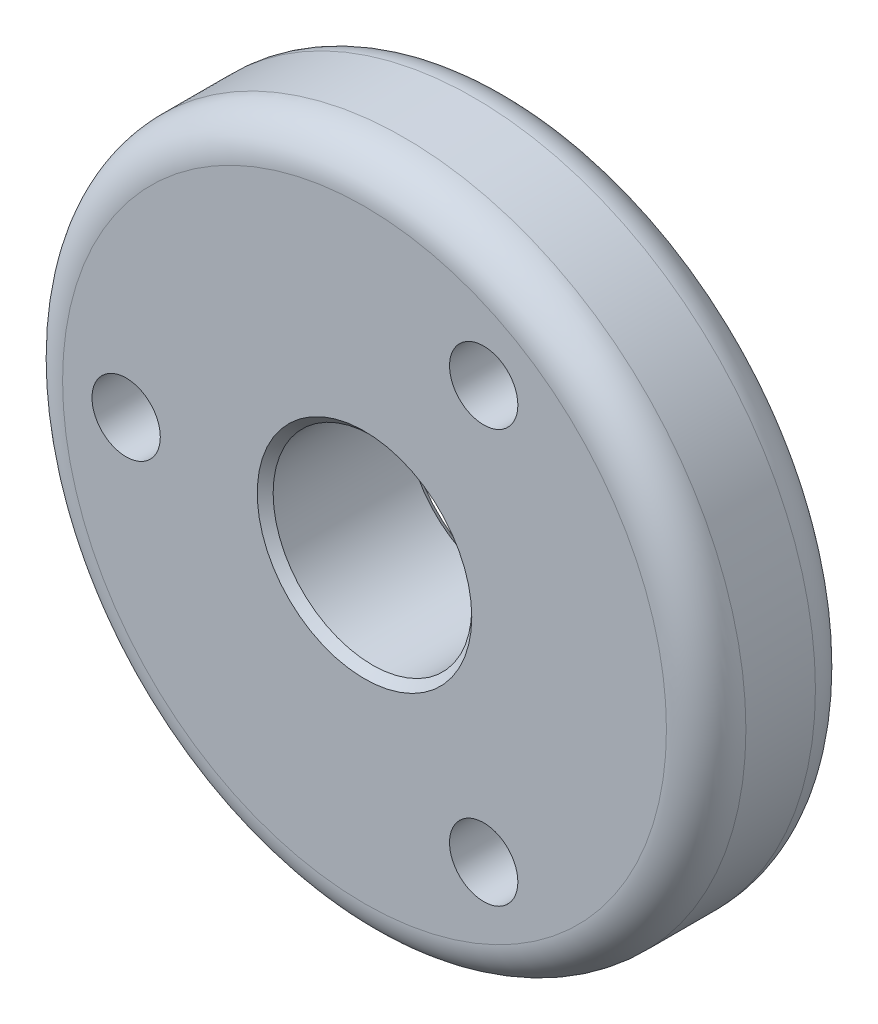
ISO-10303-21;
HEADER;
FILE_DESCRIPTION(('STEP AP214'),'2;1');
FILE_NAME('part.step','',(''),(''),'','','');
FILE_SCHEMA(('AUTOMOTIVE_DESIGN { 1 0 10303 214 1 1 1 1 }'));
ENDSEC;
DATA;
#1=APPLICATION_CONTEXT('core data for automotive mechanical design processes');
#2=APPLICATION_PROTOCOL_DEFINITION('international standard','automotive_design',2000,#1);
#3=PRODUCT_CONTEXT('',#1,'mechanical');
#4=PRODUCT('Part','Part','',(#3));
#5=PRODUCT_RELATED_PRODUCT_CATEGORY('part','',(#4));
#6=PRODUCT_DEFINITION_FORMATION('','',#4);
#7=PRODUCT_DEFINITION_CONTEXT('part definition',#1,'design');
#8=PRODUCT_DEFINITION('design','',#6,#7);
#9=PRODUCT_DEFINITION_SHAPE('','',#8);
#10=(LENGTH_UNIT() NAMED_UNIT(*) SI_UNIT(.MILLI.,.METRE.));
#11=(NAMED_UNIT(*) PLANE_ANGLE_UNIT() SI_UNIT($,.RADIAN.));
#12=(NAMED_UNIT(*) SI_UNIT($,.STERADIAN.) SOLID_ANGLE_UNIT());
#13=UNCERTAINTY_MEASURE_WITH_UNIT(LENGTH_MEASURE(1.E-05),#10,'distance_accuracy_value','');
#14=(GEOMETRIC_REPRESENTATION_CONTEXT(3) GLOBAL_UNCERTAINTY_ASSIGNED_CONTEXT((#13)) GLOBAL_UNIT_ASSIGNED_CONTEXT((#10,
#11,#12)) REPRESENTATION_CONTEXT('',''));
#15=CARTESIAN_POINT('',(0.,0.,0.));
#16=DIRECTION('',(0.,0.,1.));
#17=DIRECTION('',(1.,0.,0.));
#18=AXIS2_PLACEMENT_3D('',#15,#16,#17);
#19=CARTESIAN_POINT('',(0.,0.,1.190625));
#20=DIRECTION('',(0.,0.,1.));
#21=DIRECTION('',(1.,0.,0.));
#22=AXIS2_PLACEMENT_3D('',#19,#20,#21);
#23=PLANE('',#22);
#24=CARTESIAN_POINT('',(1.90500000000002,3.2995567884187,1.190625));
#25=DIRECTION('',(0.,0.,1.));
#26=DIRECTION('',(-0.500000000000004,-0.866025403784436,0.));
#27=AXIS2_PLACEMENT_3D('',#24,#25,#26);
#28=CIRCLE('',#27,0.546100000000001);
#29=CARTESIAN_POINT('',(1.63195000000001,2.82662031541202,1.190625));
#30=VERTEX_POINT('',#29);
#31=EDGE_CURVE('E75',#30,#30,#28,.T.);
#32=ORIENTED_EDGE('',*,*,#31,.F.);
#33=EDGE_LOOP('',(#32));
#34=FACE_BOUND('',#33,.T.);
#35=CARTESIAN_POINT('',(1.90499999999997,-3.29955678841873,1.190625));
#36=DIRECTION('',(0.,0.,1.));
#37=DIRECTION('',(-0.499999999999992,0.866025403784443,0.));
#38=AXIS2_PLACEMENT_3D('',#35,#36,#37);
#39=CIRCLE('',#38,0.546100000000001);
#40=CARTESIAN_POINT('',(1.63194999999997,-2.82662031541204,1.190625));
#41=VERTEX_POINT('',#40);
#42=EDGE_CURVE('E69',#41,#41,#39,.T.);
#43=ORIENTED_EDGE('',*,*,#42,.F.);
#44=EDGE_LOOP('',(#43));
#45=FACE_BOUND('',#44,.T.);
#46=CARTESIAN_POINT('',(-3.81,0.,1.190625));
#47=DIRECTION('',(0.,0.,1.));
#48=DIRECTION('',(1.,0.,0.));
#49=AXIS2_PLACEMENT_3D('',#46,#47,#48);
#50=CIRCLE('',#49,0.546100000000001);
#51=CARTESIAN_POINT('',(-3.2639,0.,1.190625));
#52=VERTEX_POINT('',#51);
#53=EDGE_CURVE('E63',#52,#52,#50,.T.);
#54=ORIENTED_EDGE('',*,*,#53,.F.);
#55=EDGE_LOOP('',(#54));
#56=FACE_BOUND('',#55,.T.);
#57=CARTESIAN_POINT('',(0.,0.,1.190625));
#58=DIRECTION('',(0.,0.,1.));
#59=DIRECTION('',(1.,0.,0.));
#60=AXIS2_PLACEMENT_3D('',#57,#58,#59);
#61=CIRCLE('',#60,1.71450000000001);
#62=CARTESIAN_POINT('',(1.71450000000001,0.,1.190625));
#63=VERTEX_POINT('',#62);
#64=EDGE_CURVE('E10',#63,#63,#61,.F.);
#65=ORIENTED_EDGE('',*,*,#64,.T.);
#66=EDGE_LOOP('',(#65));
#67=FACE_BOUND('',#66,.T.);
#68=CARTESIAN_POINT('',(0.,0.,1.190625));
#69=DIRECTION('',(0.,0.,1.));
#70=DIRECTION('',(1.,0.,0.));
#71=AXIS2_PLACEMENT_3D('',#68,#69,#70);
#72=CIRCLE('',#71,4.826);
#73=CARTESIAN_POINT('',(4.826,0.,1.190625));
#74=VERTEX_POINT('',#73);
#75=EDGE_CURVE('E50',#74,#74,#72,.T.);
#76=ORIENTED_EDGE('',*,*,#75,.T.);
#77=EDGE_LOOP('',(#76));
#78=FACE_BOUND('',#77,.T.);
#79=ADVANCED_FACE('F30',(#34,#45,#56,#67,#78),#23,.T.);
#80=CARTESIAN_POINT('',(0.,0.,-1.190625));
#81=DIRECTION('',(0.,0.,1.));
#82=DIRECTION('',(1.,0.,0.));
#83=AXIS2_PLACEMENT_3D('',#80,#81,#82);
#84=PLANE('',#83);
#85=CARTESIAN_POINT('',(1.90500000000002,3.2995567884187,-1.190625));
#86=DIRECTION('',(0.,0.,1.));
#87=DIRECTION('',(-0.500000000000004,-0.866025403784436,0.));
#88=AXIS2_PLACEMENT_3D('',#85,#86,#87);
#89=CIRCLE('',#88,0.546100000000001);
#90=CARTESIAN_POINT('',(1.63195000000001,2.82662031541202,-1.190625));
#91=VERTEX_POINT('',#90);
#92=EDGE_CURVE('E66',#91,#91,#89,.T.);
#93=ORIENTED_EDGE('',*,*,#92,.T.);
#94=EDGE_LOOP('',(#93));
#95=FACE_BOUND('',#94,.T.);
#96=CARTESIAN_POINT('',(1.90499999999997,-3.29955678841873,-1.190625));
#97=DIRECTION('',(0.,0.,1.));
#98=DIRECTION('',(-0.499999999999992,0.866025403784443,0.));
#99=AXIS2_PLACEMENT_3D('',#96,#97,#98);
#100=CIRCLE('',#99,0.546100000000001);
#101=CARTESIAN_POINT('',(1.63194999999997,-2.82662031541204,-1.190625));
#102=VERTEX_POINT('',#101);
#103=EDGE_CURVE('E72',#102,#102,#100,.T.);
#104=ORIENTED_EDGE('',*,*,#103,.T.);
#105=EDGE_LOOP('',(#104));
#106=FACE_BOUND('',#105,.T.);
#107=CARTESIAN_POINT('',(-3.81,0.,-1.190625));
#108=DIRECTION('',(0.,0.,1.));
#109=DIRECTION('',(1.,0.,0.));
#110=AXIS2_PLACEMENT_3D('',#107,#108,#109);
#111=CIRCLE('',#110,0.546100000000001);
#112=CARTESIAN_POINT('',(-3.2639,0.,-1.190625));
#113=VERTEX_POINT('',#112);
#114=EDGE_CURVE('E62',#113,#113,#111,.T.);
#115=ORIENTED_EDGE('',*,*,#114,.T.);
#116=EDGE_LOOP('',(#115));
#117=FACE_BOUND('',#116,.T.);
#118=CARTESIAN_POINT('',(0.,0.,-1.190625));
#119=DIRECTION('',(0.,0.,1.));
#120=DIRECTION('',(1.,0.,0.));
#121=AXIS2_PLACEMENT_3D('',#118,#119,#120);
#122=CIRCLE('',#121,1.71449999999999);
#123=CARTESIAN_POINT('',(1.71449999999999,0.,-1.190625));
#124=VERTEX_POINT('',#123);
#125=EDGE_CURVE('E45',#124,#124,#122,.T.);
#126=ORIENTED_EDGE('',*,*,#125,.T.);
#127=EDGE_LOOP('',(#126));
#128=FACE_BOUND('',#127,.T.);
#129=CARTESIAN_POINT('',(0.,0.,-1.190625));
#130=DIRECTION('',(0.,0.,1.));
#131=DIRECTION('',(1.,0.,0.));
#132=AXIS2_PLACEMENT_3D('',#129,#130,#131);
#133=CIRCLE('',#132,4.826);
#134=CARTESIAN_POINT('',(4.826,0.,-1.190625));
#135=VERTEX_POINT('',#134);
#136=EDGE_CURVE('E53',#135,#135,#133,.F.);
#137=ORIENTED_EDGE('',*,*,#136,.T.);
#138=EDGE_LOOP('',(#137));
#139=FACE_BOUND('',#138,.T.);
#140=ADVANCED_FACE('F81',(#95,#106,#117,#128,#139),#84,.F.);
#141=CARTESIAN_POINT('',(0.,0.,1.190625));
#142=DIRECTION('',(0.,0.,-1.));
#143=DIRECTION('',(-1.,0.,0.));
#144=AXIS2_PLACEMENT_3D('',#141,#142,#143);
#145=CYLINDRICAL_SURFACE('',#144,5.461);
#146=CARTESIAN_POINT('',(0.,0.,-0.555625));
#147=DIRECTION('',(0.,0.,1.));
#148=DIRECTION('',(1.,0.,0.));
#149=AXIS2_PLACEMENT_3D('',#146,#147,#148);
#150=CIRCLE('',#149,5.461);
#151=CARTESIAN_POINT('',(-5.461,0.,-0.555625));
#152=VERTEX_POINT('',#151);
#153=EDGE_CURVE('E56',#152,#152,#150,.T.);
#154=CARTESIAN_POINT('',(0.,0.,0.555625));
#155=DIRECTION('',(0.,0.,1.));
#156=DIRECTION('',(1.,0.,0.));
#157=AXIS2_PLACEMENT_3D('',#154,#155,#156);
#158=CIRCLE('',#157,5.461);
#159=CARTESIAN_POINT('',(-5.461,0.,0.555625));
#160=VERTEX_POINT('',#159);
#161=EDGE_CURVE('E59',#160,#160,#158,.F.);
#162=CARTESIAN_POINT('',(-5.461,0.,-0.555625));
#163=CARTESIAN_POINT('',(-5.461,0.,-0.544049479166667));
#164=CARTESIAN_POINT('',(-5.461,0.,-0.532473958333333));
#165=CARTESIAN_POINT('',(-5.461,0.,-0.509322916666667));
#166=CARTESIAN_POINT('',(-5.461,0.,-0.497747395833333));
#167=CARTESIAN_POINT('',(-5.461,0.,-0.474596354166667));
#168=CARTESIAN_POINT('',(-5.461,0.,-0.463020833333333));
#169=CARTESIAN_POINT('',(-5.461,0.,-0.439869791666667));
#170=CARTESIAN_POINT('',(-5.461,0.,-0.428294270833333));
#171=CARTESIAN_POINT('',(-5.461,0.,-0.405143229166667));
#172=CARTESIAN_POINT('',(-5.461,0.,-0.393567708333333));
#173=CARTESIAN_POINT('',(-5.461,0.,-0.370416666666667));
#174=CARTESIAN_POINT('',(-5.461,0.,-0.358841145833333));
#175=CARTESIAN_POINT('',(-5.461,0.,-0.335690104166667));
#176=CARTESIAN_POINT('',(-5.461,0.,-0.324114583333333));
#177=CARTESIAN_POINT('',(-5.461,0.,-0.300963541666667));
#178=CARTESIAN_POINT('',(-5.461,0.,-0.289388020833333));
#179=CARTESIAN_POINT('',(-5.461,0.,-0.266236979166667));
#180=CARTESIAN_POINT('',(-5.461,0.,-0.254661458333333));
#181=CARTESIAN_POINT('',(-5.461,0.,-0.231510416666667));
#182=CARTESIAN_POINT('',(-5.461,0.,-0.219934895833333));
#183=CARTESIAN_POINT('',(-5.461,0.,-0.196783854166667));
#184=CARTESIAN_POINT('',(-5.461,0.,-0.185208333333333));
#185=CARTESIAN_POINT('',(-5.461,0.,-0.162057291666667));
#186=CARTESIAN_POINT('',(-5.461,0.,-0.150481770833333));
#187=CARTESIAN_POINT('',(-5.461,0.,-0.127330729166667));
#188=CARTESIAN_POINT('',(-5.461,0.,-0.115755208333333));
#189=CARTESIAN_POINT('',(-5.461,0.,-0.0926041666666666));
#190=CARTESIAN_POINT('',(-5.461,0.,-0.0810286458333333));
#191=CARTESIAN_POINT('',(-5.461,0.,-0.0578776041666667));
#192=CARTESIAN_POINT('',(-5.461,0.,-0.0463020833333334));
#193=CARTESIAN_POINT('',(-5.461,0.,-0.0231510416666667));
#194=CARTESIAN_POINT('',(-5.461,0.,-0.0115755208333333));
#195=CARTESIAN_POINT('',(-5.461,0.,0.0115755208333333));
#196=CARTESIAN_POINT('',(-5.461,0.,0.0231510416666667));
#197=CARTESIAN_POINT('',(-5.461,0.,0.0463020833333334));
#198=CARTESIAN_POINT('',(-5.461,0.,0.0578776041666667));
#199=CARTESIAN_POINT('',(-5.461,0.,0.0810286458333333));
#200=CARTESIAN_POINT('',(-5.461,0.,0.0926041666666666));
#201=CARTESIAN_POINT('',(-5.461,0.,0.115755208333333));
#202=CARTESIAN_POINT('',(-5.461,0.,0.127330729166667));
#203=CARTESIAN_POINT('',(-5.461,0.,0.150481770833333));
#204=CARTESIAN_POINT('',(-5.461,0.,0.162057291666667));
#205=CARTESIAN_POINT('',(-5.461,0.,0.185208333333333));
#206=CARTESIAN_POINT('',(-5.461,0.,0.196783854166667));
#207=CARTESIAN_POINT('',(-5.461,0.,0.219934895833333));
#208=CARTESIAN_POINT('',(-5.461,0.,0.231510416666667));
#209=CARTESIAN_POINT('',(-5.461,0.,0.254661458333333));
#210=CARTESIAN_POINT('',(-5.461,0.,0.266236979166667));
#211=CARTESIAN_POINT('',(-5.461,0.,0.289388020833333));
#212=CARTESIAN_POINT('',(-5.461,0.,0.300963541666667));
#213=CARTESIAN_POINT('',(-5.461,0.,0.324114583333333));
#214=CARTESIAN_POINT('',(-5.461,0.,0.335690104166667));
#215=CARTESIAN_POINT('',(-5.461,0.,0.358841145833333));
#216=CARTESIAN_POINT('',(-5.461,0.,0.370416666666667));
#217=CARTESIAN_POINT('',(-5.461,0.,0.393567708333333));
#218=CARTESIAN_POINT('',(-5.461,0.,0.405143229166667));
#219=CARTESIAN_POINT('',(-5.461,0.,0.428294270833333));
#220=CARTESIAN_POINT('',(-5.461,0.,0.439869791666667));
#221=CARTESIAN_POINT('',(-5.461,0.,0.463020833333333));
#222=CARTESIAN_POINT('',(-5.461,0.,0.474596354166667));
#223=CARTESIAN_POINT('',(-5.461,0.,0.497747395833333));
#224=CARTESIAN_POINT('',(-5.461,0.,0.509322916666667));
#225=CARTESIAN_POINT('',(-5.461,0.,0.532473958333333));
#226=CARTESIAN_POINT('',(-5.461,0.,0.544049479166667));
#227=CARTESIAN_POINT('',(-5.461,0.,0.555625));
#228=B_SPLINE_CURVE_WITH_KNOTS('',3,(#162,#163,#164,#165,#166,#167,#168,#169,#170,#171,#172,
#173,#174,#175,#176,#177,#178,#179,#180,#181,#182,#183,#184,#185,#186,#187,#188,#189,#190,#191,
#192,#193,#194,#195,#196,#197,#198,#199,#200,#201,#202,#203,#204,#205,#206,#207,#208,#209,#210,
#211,#212,#213,#214,#215,#216,#217,#218,#219,#220,#221,#222,#223,#224,#225,#226,#227),
.UNSPECIFIED.,.F.,.F.,(4,2,2,2,2,2,2,2,2,2,2,2,2,2,2,2,2,2,2,2,2,2,2,2,2,2,2,2,2,2,2,2,4),(0.,
0.0347265625,0.0694531250000001,0.1041796875,0.13890625,0.1736328125,0.208359375,0.2430859375,
0.2778125,0.3125390625,0.347265625,0.3819921875,0.41671875,0.4514453125,0.486171875,
0.5208984375,0.555625,0.5903515625,0.625078125,0.6598046875,0.69453125,0.7292578125,0.763984375,
0.7987109375,0.8334375,0.8681640625,0.902890625,0.9376171875,0.97234375,1.0070703125,
1.041796875,1.0765234375,1.11125),.UNSPECIFIED.);
#229=EDGE_CURVE('BSEAM116',#152,#160,#228,.T.);
#230=ORIENTED_EDGE('',*,*,#153,.T.);
#231=ORIENTED_EDGE('',*,*,#161,.T.);
#232=ORIENTED_EDGE('',*,*,#229,.T.);
#233=ORIENTED_EDGE('',*,*,#229,.F.);
#234=EDGE_LOOP('',(#230,#232,#231,#233));
#235=FACE_BOUND('',#234,.T.);
#236=ADVANCED_FACE('F116',(#235),#145,.T.);
#237=CARTESIAN_POINT('',(0.,0.,1.190625));
#238=DIRECTION('',(0.,0.,-1.));
#239=DIRECTION('',(-1.,0.,0.));
#240=AXIS2_PLACEMENT_3D('',#237,#238,#239);
#241=CYLINDRICAL_SURFACE('',#240,1.5875);
#242=CARTESIAN_POINT('',(0.,0.,-1.06362500000001));
#243=DIRECTION('',(0.,0.,1.));
#244=DIRECTION('',(1.,0.,0.));
#245=AXIS2_PLACEMENT_3D('',#242,#243,#244);
#246=CIRCLE('',#245,1.5875);
#247=CARTESIAN_POINT('',(-1.5875,0.,-1.06362500000001));
#248=VERTEX_POINT('',#247);
#249=EDGE_CURVE('E37',#248,#248,#246,.F.);
#250=CARTESIAN_POINT('',(0.,0.,1.06362499999999));
#251=DIRECTION('',(0.,0.,1.));
#252=DIRECTION('',(1.,0.,0.));
#253=AXIS2_PLACEMENT_3D('',#250,#251,#252);
#254=CIRCLE('',#253,1.5875);
#255=CARTESIAN_POINT('',(-1.5875,0.,1.06362499999999));
#256=VERTEX_POINT('',#255);
#257=EDGE_CURVE('E41',#256,#256,#254,.T.);
#258=CARTESIAN_POINT('',(-1.5875,0.,-1.06362500000001));
#259=CARTESIAN_POINT('',(-1.5875,0.,-1.04146614583334));
#260=CARTESIAN_POINT('',(-1.5875,0.,-1.01930729166667));
#261=CARTESIAN_POINT('',(-1.5875,0.,-0.97498958333334));
#262=CARTESIAN_POINT('',(-1.5875,0.,-0.952830729166673));
#263=CARTESIAN_POINT('',(-1.5875,0.,-0.90851302083334));
#264=CARTESIAN_POINT('',(-1.5875,0.,-0.886354166666674));
#265=CARTESIAN_POINT('',(-1.5875,0.,-0.842036458333341));
#266=CARTESIAN_POINT('',(-1.5875,0.,-0.819877604166674));
#267=CARTESIAN_POINT('',(-1.5875,0.,-0.775559895833341));
#268=CARTESIAN_POINT('',(-1.5875,0.,-0.753401041666674));
#269=CARTESIAN_POINT('',(-1.5875,0.,-0.709083333333341));
#270=CARTESIAN_POINT('',(-1.5875,0.,-0.686924479166674));
#271=CARTESIAN_POINT('',(-1.5875,0.,-0.642606770833341));
#272=CARTESIAN_POINT('',(-1.5875,0.,-0.620447916666675));
#273=CARTESIAN_POINT('',(-1.5875,0.,-0.576130208333342));
#274=CARTESIAN_POINT('',(-1.5875,0.,-0.553971354166675));
#275=CARTESIAN_POINT('',(-1.5875,0.,-0.509653645833342));
#276=CARTESIAN_POINT('',(-1.5875,0.,-0.487494791666675));
#277=CARTESIAN_POINT('',(-1.5875,0.,-0.443177083333342));
#278=CARTESIAN_POINT('',(-1.5875,0.,-0.421018229166675));
#279=CARTESIAN_POINT('',(-1.5875,0.,-0.376700520833342));
#280=CARTESIAN_POINT('',(-1.5875,0.,-0.354541666666675));
#281=CARTESIAN_POINT('',(-1.5875,0.,-0.310223958333342));
#282=CARTESIAN_POINT('',(-1.5875,0.,-0.288065104166676));
#283=CARTESIAN_POINT('',(-1.5875,0.,-0.243747395833342));
#284=CARTESIAN_POINT('',(-1.5875,0.,-0.221588541666676));
#285=CARTESIAN_POINT('',(-1.5875,0.,-0.177270833333343));
#286=CARTESIAN_POINT('',(-1.5875,0.,-0.155111979166676));
#287=CARTESIAN_POINT('',(-1.5875,0.,-0.110794270833343));
#288=CARTESIAN_POINT('',(-1.5875,0.,-0.0886354166666762));
#289=CARTESIAN_POINT('',(-1.5875,0.,-0.044317708333343));
#290=CARTESIAN_POINT('',(-1.5875,0.,-0.0221588541666764));
#291=CARTESIAN_POINT('',(-1.5875,0.,0.0221588541666569));
#292=CARTESIAN_POINT('',(-1.5875,0.,0.0443177083333235));
#293=CARTESIAN_POINT('',(-1.5875,0.,0.0886354166666567));
#294=CARTESIAN_POINT('',(-1.5875,0.,0.110794270833323));
#295=CARTESIAN_POINT('',(-1.5875,0.,0.155111979166656));
#296=CARTESIAN_POINT('',(-1.5875,0.,0.177270833333323));
#297=CARTESIAN_POINT('',(-1.5875,0.,0.221588541666656));
#298=CARTESIAN_POINT('',(-1.5875,0.,0.243747395833323));
#299=CARTESIAN_POINT('',(-1.5875,0.,0.288065104166656));
#300=CARTESIAN_POINT('',(-1.5875,0.,0.310223958333323));
#301=CARTESIAN_POINT('',(-1.5875,0.,0.354541666666656));
#302=CARTESIAN_POINT('',(-1.5875,0.,0.376700520833322));
#303=CARTESIAN_POINT('',(-1.5875,0.,0.421018229166656));
#304=CARTESIAN_POINT('',(-1.5875,0.,0.443177083333322));
#305=CARTESIAN_POINT('',(-1.5875,0.,0.487494791666655));
#306=CARTESIAN_POINT('',(-1.5875,0.,0.509653645833322));
#307=CARTESIAN_POINT('',(-1.5875,0.,0.553971354166655));
#308=CARTESIAN_POINT('',(-1.5875,0.,0.576130208333322));
#309=CARTESIAN_POINT('',(-1.5875,0.,0.620447916666655));
#310=CARTESIAN_POINT('',(-1.5875,0.,0.642606770833322));
#311=CARTESIAN_POINT('',(-1.5875,0.,0.686924479166655));
#312=CARTESIAN_POINT('',(-1.5875,0.,0.709083333333321));
#313=CARTESIAN_POINT('',(-1.5875,0.,0.753401041666655));
#314=CARTESIAN_POINT('',(-1.5875,0.,0.775559895833321));
#315=CARTESIAN_POINT('',(-1.5875,0.,0.819877604166654));
#316=CARTESIAN_POINT('',(-1.5875,0.,0.842036458333321));
#317=CARTESIAN_POINT('',(-1.5875,0.,0.886354166666654));
#318=CARTESIAN_POINT('',(-1.5875,0.,0.908513020833321));
#319=CARTESIAN_POINT('',(-1.5875,0.,0.952830729166654));
#320=CARTESIAN_POINT('',(-1.5875,0.,0.974989583333321));
#321=CARTESIAN_POINT('',(-1.5875,0.,1.01930729166665));
#322=CARTESIAN_POINT('',(-1.5875,0.,1.04146614583332));
#323=CARTESIAN_POINT('',(-1.5875,0.,1.06362499999999));
#324=B_SPLINE_CURVE_WITH_KNOTS('',3,(#258,#259,#260,#261,#262,#263,#264,#265,#266,#267,#268,
#269,#270,#271,#272,#273,#274,#275,#276,#277,#278,#279,#280,#281,#282,#283,#284,#285,#286,#287,
#288,#289,#290,#291,#292,#293,#294,#295,#296,#297,#298,#299,#300,#301,#302,#303,#304,#305,#306,
#307,#308,#309,#310,#311,#312,#313,#314,#315,#316,#317,#318,#319,#320,#321,#322,#323),
.UNSPECIFIED.,.F.,.F.,(4,2,2,2,2,2,2,2,2,2,2,2,2,2,2,2,2,2,2,2,2,2,2,2,2,2,2,2,2,2,2,2,4),(0.,
0.0664765624999999,0.132953125,0.199429687499999,0.265906249999999,0.332382812499999,
0.398859374999999,0.465335937499999,0.531812499999998,0.598289062499998,0.664765624999998,
0.731242187499998,0.797718749999998,0.864195312499997,0.930671874999997,0.997148437499997,
1.063625,1.1301015625,1.196578125,1.2630546875,1.32953125,1.3960078125,1.462484375,1.5289609375,
1.5954375,1.6619140625,1.728390625,1.79486718749999,1.86134374999999,1.92782031249999,
1.99429687499999,2.06077343749999,2.12724999999999),.UNSPECIFIED.);
#325=EDGE_CURVE('BSEAM111',#248,#256,#324,.T.);
#326=ORIENTED_EDGE('',*,*,#249,.T.);
#327=ORIENTED_EDGE('',*,*,#257,.T.);
#328=ORIENTED_EDGE('',*,*,#325,.T.);
#329=ORIENTED_EDGE('',*,*,#325,.F.);
#330=EDGE_LOOP('',(#326,#328,#327,#329));
#331=FACE_BOUND('',#330,.T.);
#332=ADVANCED_FACE('F111',(#331),#241,.F.);
#333=CARTESIAN_POINT('',(0.,0.,-0.555625));
#334=DIRECTION('',(0.,0.,1.));
#335=DIRECTION('',(1.,0.,0.));
#336=AXIS2_PLACEMENT_3D('',#333,#334,#335);
#337=TOROIDAL_SURFACE('',#336,4.826,0.635);
#338=ORIENTED_EDGE('',*,*,#136,.F.);
#339=EDGE_LOOP('',(#338));
#340=FACE_BOUND('',#339,.T.);
#341=ORIENTED_EDGE('',*,*,#153,.F.);
#342=EDGE_LOOP('',(#341));
#343=FACE_BOUND('',#342,.T.);
#344=ADVANCED_FACE('F103',(#340,#343),#337,.T.);
#345=CARTESIAN_POINT('',(0.,0.,0.555625));
#346=DIRECTION('',(0.,0.,1.));
#347=DIRECTION('',(1.,0.,0.));
#348=AXIS2_PLACEMENT_3D('',#345,#346,#347);
#349=TOROIDAL_SURFACE('',#348,4.826,0.635);
#350=ORIENTED_EDGE('',*,*,#161,.F.);
#351=EDGE_LOOP('',(#350));
#352=FACE_BOUND('',#351,.T.);
#353=ORIENTED_EDGE('',*,*,#75,.F.);
#354=EDGE_LOOP('',(#353));
#355=FACE_BOUND('',#354,.T.);
#356=ADVANCED_FACE('F100',(#352,#355),#349,.T.);
#357=CARTESIAN_POINT('',(0.,0.,-1.190625));
#358=DIRECTION('',(0.,0.,-1.));
#359=DIRECTION('',(-1.,0.,0.));
#360=AXIS2_PLACEMENT_3D('',#357,#358,#359);
#361=CONICAL_SURFACE('',#360,1.71449999999999,0.785398163397447);
#362=ORIENTED_EDGE('',*,*,#249,.F.);
#363=EDGE_LOOP('',(#362));
#364=FACE_BOUND('',#363,.T.);
#365=ORIENTED_EDGE('',*,*,#125,.F.);
#366=EDGE_LOOP('',(#365));
#367=FACE_BOUND('',#366,.T.);
#368=ADVANCED_FACE('F102',(#364,#367),#361,.F.);
#369=CARTESIAN_POINT('',(0.,0.,1.06362499999999));
#370=DIRECTION('',(0.,0.,1.));
#371=DIRECTION('',(1.,0.,0.));
#372=AXIS2_PLACEMENT_3D('',#369,#370,#371);
#373=CONICAL_SURFACE('',#372,1.5875,0.785398163397448);
#374=ORIENTED_EDGE('',*,*,#64,.F.);
#375=EDGE_LOOP('',(#374));
#376=FACE_BOUND('',#375,.T.);
#377=ORIENTED_EDGE('',*,*,#257,.F.);
#378=EDGE_LOOP('',(#377));
#379=FACE_BOUND('',#378,.T.);
#380=ADVANCED_FACE('F32',(#376,#379),#373,.F.);
#381=CARTESIAN_POINT('',(-3.81,0.,-1.190625));
#382=DIRECTION('',(0.,0.,1.));
#383=DIRECTION('',(1.,0.,0.));
#384=AXIS2_PLACEMENT_3D('',#381,#382,#383);
#385=CYLINDRICAL_SURFACE('',#384,0.546100000000001);
#386=ORIENTED_EDGE('',*,*,#114,.F.);
#387=EDGE_LOOP('',(#386));
#388=FACE_BOUND('',#387,.T.);
#389=ORIENTED_EDGE('',*,*,#53,.T.);
#390=EDGE_LOOP('',(#389));
#391=FACE_BOUND('',#390,.T.);
#392=ADVANCED_FACE('F124',(#388,#391),#385,.F.);
#393=CARTESIAN_POINT('',(1.90499999999997,-3.29955678841873,-1.190625));
#394=DIRECTION('',(0.,0.,1.));
#395=DIRECTION('',(1.,0.,0.));
#396=AXIS2_PLACEMENT_3D('',#393,#394,#395);
#397=CYLINDRICAL_SURFACE('',#396,0.546100000000001);
#398=ORIENTED_EDGE('',*,*,#103,.F.);
#399=EDGE_LOOP('',(#398));
#400=FACE_BOUND('',#399,.T.);
#401=ORIENTED_EDGE('',*,*,#42,.T.);
#402=EDGE_LOOP('',(#401));
#403=FACE_BOUND('',#402,.T.);
#404=ADVANCED_FACE('F87',(#400,#403),#397,.F.);
#405=CARTESIAN_POINT('',(1.90500000000002,3.2995567884187,-1.190625));
#406=DIRECTION('',(0.,0.,1.));
#407=DIRECTION('',(1.,0.,0.));
#408=AXIS2_PLACEMENT_3D('',#405,#406,#407);
#409=CYLINDRICAL_SURFACE('',#408,0.546100000000001);
#410=ORIENTED_EDGE('',*,*,#92,.F.);
#411=EDGE_LOOP('',(#410));
#412=FACE_BOUND('',#411,.T.);
#413=ORIENTED_EDGE('',*,*,#31,.T.);
#414=EDGE_LOOP('',(#413));
#415=FACE_BOUND('',#414,.T.);
#416=ADVANCED_FACE('F84',(#412,#415),#409,.F.);
#417=CLOSED_SHELL('',(#79,#140,#236,#332,#344,#356,#368,#380,#392,#404,#416));
#418=MANIFOLD_SOLID_BREP('B2',#417);
#419=ADVANCED_BREP_SHAPE_REPRESENTATION('',(#18,#418),#14);
#420=SHAPE_DEFINITION_REPRESENTATION(#9,#419);
ENDSEC;
END-ISO-10303-21;
